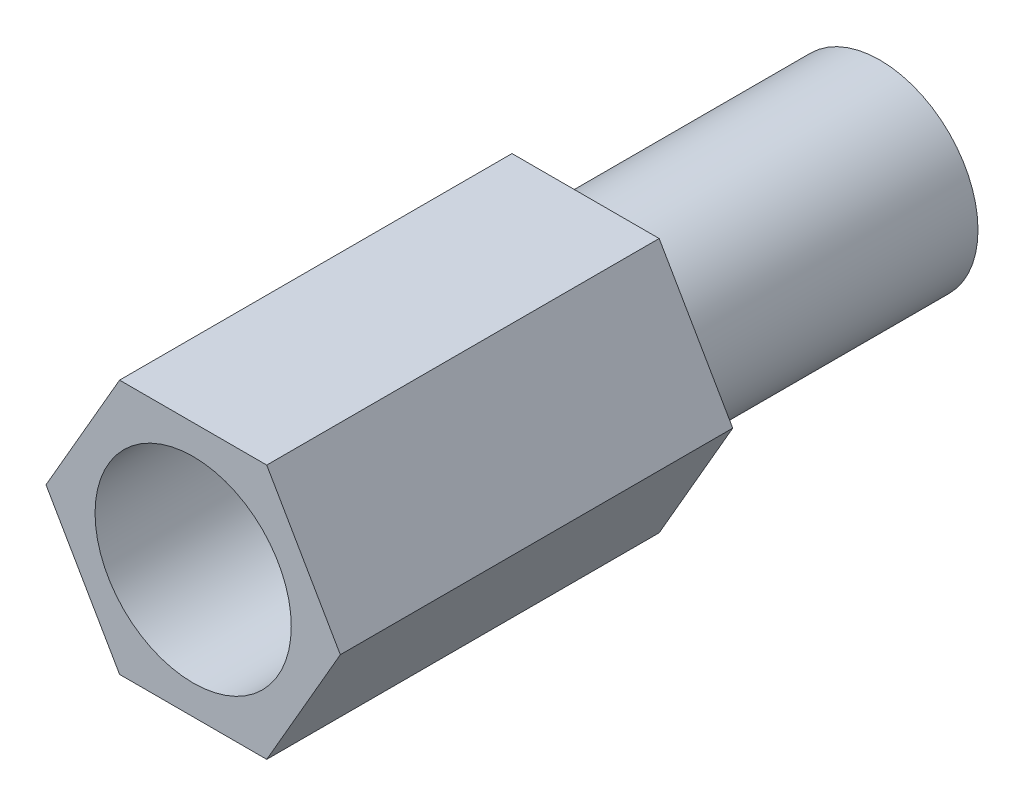
ISO-10303-21;
HEADER;
FILE_DESCRIPTION(('STEP AP214'),'2;1');
FILE_NAME('part.step','',(''),(''),'','','');
FILE_SCHEMA(('AUTOMOTIVE_DESIGN { 1 0 10303 214 1 1 1 1 }'));
ENDSEC;
DATA;
#1=APPLICATION_CONTEXT('core data for automotive mechanical design processes');
#2=APPLICATION_PROTOCOL_DEFINITION('international standard','automotive_design',2000,#1);
#3=PRODUCT_CONTEXT('',#1,'mechanical');
#4=PRODUCT('Part','Part','',(#3));
#5=PRODUCT_RELATED_PRODUCT_CATEGORY('part','',(#4));
#6=PRODUCT_DEFINITION_FORMATION('','',#4);
#7=PRODUCT_DEFINITION_CONTEXT('part definition',#1,'design');
#8=PRODUCT_DEFINITION('design','',#6,#7);
#9=PRODUCT_DEFINITION_SHAPE('','',#8);
#10=(LENGTH_UNIT() NAMED_UNIT(*) SI_UNIT(.MILLI.,.METRE.));
#11=(NAMED_UNIT(*) PLANE_ANGLE_UNIT() SI_UNIT($,.RADIAN.));
#12=(NAMED_UNIT(*) SI_UNIT($,.STERADIAN.) SOLID_ANGLE_UNIT());
#13=UNCERTAINTY_MEASURE_WITH_UNIT(LENGTH_MEASURE(1.E-05),#10,'distance_accuracy_value','');
#14=(GEOMETRIC_REPRESENTATION_CONTEXT(3) GLOBAL_UNCERTAINTY_ASSIGNED_CONTEXT((#13)) GLOBAL_UNIT_ASSIGNED_CONTEXT((#10,
#11,#12)) REPRESENTATION_CONTEXT('',''));
#15=CARTESIAN_POINT('',(0.,0.,0.));
#16=DIRECTION('',(0.,0.,1.));
#17=DIRECTION('',(1.,0.,0.));
#18=AXIS2_PLACEMENT_3D('',#15,#16,#17);
#19=CARTESIAN_POINT('',(0.,0.,-3.));
#20=DIRECTION('',(0.,0.,1.));
#21=DIRECTION('',(1.,0.,0.));
#22=AXIS2_PLACEMENT_3D('',#19,#20,#21);
#23=CYLINDRICAL_SURFACE('',#22,1.);
#24=CARTESIAN_POINT('',(0.,0.,-3.));
#25=DIRECTION('',(0.,0.,1.));
#26=DIRECTION('',(1.,0.,0.));
#27=AXIS2_PLACEMENT_3D('',#24,#25,#26);
#28=CIRCLE('',#27,1.);
#29=CARTESIAN_POINT('',(1.,0.,-3.));
#30=VERTEX_POINT('',#29);
#31=EDGE_CURVE('E11',#30,#30,#28,.T.);
#32=ORIENTED_EDGE('',*,*,#31,.T.);
#33=EDGE_LOOP('',(#32));
#34=FACE_BOUND('',#33,.T.);
#35=CARTESIAN_POINT('',(0.,0.,0.));
#36=DIRECTION('',(0.,0.,1.));
#37=DIRECTION('',(1.,0.,0.));
#38=AXIS2_PLACEMENT_3D('',#35,#36,#37);
#39=CIRCLE('',#38,1.);
#40=CARTESIAN_POINT('',(1.,0.,0.));
#41=VERTEX_POINT('',#40);
#42=EDGE_CURVE('E50',#41,#41,#39,.T.);
#43=ORIENTED_EDGE('',*,*,#42,.F.);
#44=EDGE_LOOP('',(#43));
#45=FACE_BOUND('',#44,.T.);
#46=ADVANCED_FACE('F47',(#34,#45),#23,.T.);
#47=CARTESIAN_POINT('',(0.,0.,-3.));
#48=DIRECTION('',(0.,0.,1.));
#49=DIRECTION('',(1.,0.,0.));
#50=AXIS2_PLACEMENT_3D('',#47,#48,#49);
#51=PLANE('',#50);
#52=ORIENTED_EDGE('',*,*,#31,.F.);
#53=EDGE_LOOP('',(#52));
#54=FACE_BOUND('',#53,.T.);
#55=ADVANCED_FACE('F62',(#54),#51,.F.);
#56=CARTESIAN_POINT('',(0.,0.,0.));
#57=DIRECTION('',(0.,0.,1.));
#58=DIRECTION('',(1.,0.,0.));
#59=AXIS2_PLACEMENT_3D('',#56,#57,#58);
#60=PLANE('',#59);
#61=ORIENTED_EDGE('',*,*,#42,.T.);
#62=EDGE_LOOP('',(#61));
#63=FACE_BOUND('',#62,.T.);
#64=ADVANCED_FACE('F59',(#63),#60,.T.);
#65=CLOSED_SHELL('',(#46,#55,#64));
#66=MANIFOLD_SOLID_BREP('B2',#65);
#67=CARTESIAN_POINT('',(0.,0.,4.));
#68=DIRECTION('',(0.,0.,1.));
#69=DIRECTION('',(1.,0.,0.));
#70=AXIS2_PLACEMENT_3D('',#67,#68,#69);
#71=PLANE('',#70);
#72=DIRECTION('',(-0.5,-0.866025403784439,0.));
#73=VECTOR('',#72,1.);
#74=CARTESIAN_POINT('',(-0.75,1.29903810567666,4.));
#75=LINE('',#74,#73);
#76=CARTESIAN_POINT('',(-0.75,1.29903810567666,4.));
#77=VERTEX_POINT('',#76);
#78=CARTESIAN_POINT('',(-1.5,0.,4.));
#79=VERTEX_POINT('',#78);
#80=EDGE_CURVE('E195',#77,#79,#75,.T.);
#81=ORIENTED_EDGE('',*,*,#80,.T.);
#82=DIRECTION('',(0.5,-0.866025403784439,0.));
#83=VECTOR('',#82,1.);
#84=CARTESIAN_POINT('',(-1.5,0.,4.));
#85=LINE('',#84,#83);
#86=CARTESIAN_POINT('',(-0.75,-1.29903810567666,4.));
#87=VERTEX_POINT('',#86);
#88=EDGE_CURVE('E143',#79,#87,#85,.T.);
#89=ORIENTED_EDGE('',*,*,#88,.T.);
#90=DIRECTION('',(1.,0.,0.));
#91=VECTOR('',#90,1.);
#92=CARTESIAN_POINT('',(-0.75,-1.29903810567666,4.));
#93=LINE('',#92,#91);
#94=CARTESIAN_POINT('',(0.75,-1.29903810567666,4.));
#95=VERTEX_POINT('',#94);
#96=EDGE_CURVE('E156',#87,#95,#93,.T.);
#97=ORIENTED_EDGE('',*,*,#96,.T.);
#98=DIRECTION('',(0.5,0.866025403784439,0.));
#99=VECTOR('',#98,1.);
#100=CARTESIAN_POINT('',(0.75,-1.29903810567666,4.));
#101=LINE('',#100,#99);
#102=CARTESIAN_POINT('',(1.5,0.,4.));
#103=VERTEX_POINT('',#102);
#104=EDGE_CURVE('E150',#95,#103,#101,.T.);
#105=ORIENTED_EDGE('',*,*,#104,.T.);
#106=DIRECTION('',(-0.5,0.866025403784439,0.));
#107=VECTOR('',#106,1.);
#108=CARTESIAN_POINT('',(1.5,0.,4.));
#109=LINE('',#108,#107);
#110=CARTESIAN_POINT('',(0.75,1.29903810567666,4.));
#111=VERTEX_POINT('',#110);
#112=EDGE_CURVE('E154',#103,#111,#109,.T.);
#113=ORIENTED_EDGE('',*,*,#112,.T.);
#114=DIRECTION('',(-1.,0.,0.));
#115=VECTOR('',#114,1.);
#116=CARTESIAN_POINT('',(0.75,1.29903810567666,4.));
#117=LINE('',#116,#115);
#118=EDGE_CURVE('E106',#111,#77,#117,.T.);
#119=ORIENTED_EDGE('',*,*,#118,.T.);
#120=EDGE_LOOP('',(#81,#89,#97,#105,#113,#119));
#121=FACE_BOUND('',#120,.T.);
#122=CARTESIAN_POINT('',(0.,0.,4.));
#123=DIRECTION('',(0.,0.,1.));
#124=DIRECTION('',(1.,0.,0.));
#125=AXIS2_PLACEMENT_3D('',#122,#123,#124);
#126=CIRCLE('',#125,1.);
#127=CARTESIAN_POINT('',(1.,0.,4.));
#128=VERTEX_POINT('',#127);
#129=EDGE_CURVE('E183',#128,#128,#126,.T.);
#130=ORIENTED_EDGE('',*,*,#129,.F.);
#131=EDGE_LOOP('',(#130));
#132=FACE_BOUND('',#131,.T.);
#133=ADVANCED_FACE('F88',(#121,#132),#71,.T.);
#134=CARTESIAN_POINT('',(0.,0.,0.));
#135=DIRECTION('',(0.,0.,1.));
#136=DIRECTION('',(1.,0.,0.));
#137=AXIS2_PLACEMENT_3D('',#134,#135,#136);
#138=PLANE('',#137);
#139=DIRECTION('',(-0.5,-0.866025403784439,0.));
#140=VECTOR('',#139,1.);
#141=CARTESIAN_POINT('',(-0.75,1.29903810567666,0.));
#142=LINE('',#141,#140);
#143=CARTESIAN_POINT('',(-0.75,1.29903810567666,0.));
#144=VERTEX_POINT('',#143);
#145=CARTESIAN_POINT('',(-1.5,0.,0.));
#146=VERTEX_POINT('',#145);
#147=EDGE_CURVE('E178',#144,#146,#142,.T.);
#148=ORIENTED_EDGE('',*,*,#147,.F.);
#149=DIRECTION('',(-1.,0.,0.));
#150=VECTOR('',#149,1.);
#151=CARTESIAN_POINT('',(0.75,1.29903810567666,0.));
#152=LINE('',#151,#150);
#153=CARTESIAN_POINT('',(0.75,1.29903810567666,0.));
#154=VERTEX_POINT('',#153);
#155=EDGE_CURVE('E135',#154,#144,#152,.T.);
#156=ORIENTED_EDGE('',*,*,#155,.F.);
#157=DIRECTION('',(-0.5,0.866025403784439,0.));
#158=VECTOR('',#157,1.);
#159=CARTESIAN_POINT('',(1.5,0.,0.));
#160=LINE('',#159,#158);
#161=CARTESIAN_POINT('',(1.5,0.,0.));
#162=VERTEX_POINT('',#161);
#163=EDGE_CURVE('E129',#162,#154,#160,.T.);
#164=ORIENTED_EDGE('',*,*,#163,.F.);
#165=DIRECTION('',(0.5,0.866025403784439,0.));
#166=VECTOR('',#165,1.);
#167=CARTESIAN_POINT('',(0.75,-1.29903810567666,0.));
#168=LINE('',#167,#166);
#169=CARTESIAN_POINT('',(0.75,-1.29903810567666,0.));
#170=VERTEX_POINT('',#169);
#171=EDGE_CURVE('E165',#170,#162,#168,.T.);
#172=ORIENTED_EDGE('',*,*,#171,.F.);
#173=DIRECTION('',(1.,0.,0.));
#174=VECTOR('',#173,1.);
#175=CARTESIAN_POINT('',(-0.75,-1.29903810567666,0.));
#176=LINE('',#175,#174);
#177=CARTESIAN_POINT('',(-0.75,-1.29903810567666,0.));
#178=VERTEX_POINT('',#177);
#179=EDGE_CURVE('E186',#178,#170,#176,.T.);
#180=ORIENTED_EDGE('',*,*,#179,.F.);
#181=DIRECTION('',(0.5,-0.866025403784439,0.));
#182=VECTOR('',#181,1.);
#183=CARTESIAN_POINT('',(-1.5,0.,0.));
#184=LINE('',#183,#182);
#185=EDGE_CURVE('E182',#146,#178,#184,.T.);
#186=ORIENTED_EDGE('',*,*,#185,.F.);
#187=EDGE_LOOP('',(#148,#156,#164,#172,#180,#186));
#188=FACE_BOUND('',#187,.T.);
#189=CARTESIAN_POINT('',(0.,0.,0.));
#190=DIRECTION('',(0.,0.,1.));
#191=DIRECTION('',(1.,0.,0.));
#192=AXIS2_PLACEMENT_3D('',#189,#190,#191);
#193=CIRCLE('',#192,1.);
#194=CARTESIAN_POINT('',(1.,0.,0.));
#195=VERTEX_POINT('',#194);
#196=EDGE_CURVE('E292',#195,#195,#193,.T.);
#197=ORIENTED_EDGE('',*,*,#196,.T.);
#198=EDGE_LOOP('',(#197));
#199=FACE_BOUND('',#198,.T.);
#200=ADVANCED_FACE('F208',(#188,#199),#138,.F.);
#201=CARTESIAN_POINT('',(-0.75,1.29903810567666,4.));
#202=DIRECTION('',(0.866025403784439,-0.5,0.));
#203=DIRECTION('',(0.5,0.866025403784439,0.));
#204=AXIS2_PLACEMENT_3D('',#201,#202,#203);
#205=PLANE('',#204);
#206=ORIENTED_EDGE('',*,*,#147,.T.);
#207=DIRECTION('',(0.,0.,-1.));
#208=VECTOR('',#207,1.);
#209=CARTESIAN_POINT('',(-1.5,0.,4.));
#210=LINE('',#209,#208);
#211=EDGE_CURVE('E45',#79,#146,#210,.T.);
#212=ORIENTED_EDGE('',*,*,#211,.F.);
#213=ORIENTED_EDGE('',*,*,#80,.F.);
#214=DIRECTION('',(0.,0.,-1.));
#215=VECTOR('',#214,1.);
#216=CARTESIAN_POINT('',(-0.75,1.29903810567666,4.));
#217=LINE('',#216,#215);
#218=EDGE_CURVE('E174',#77,#144,#217,.T.);
#219=ORIENTED_EDGE('',*,*,#218,.T.);
#220=EDGE_LOOP('',(#206,#212,#213,#219));
#221=FACE_BOUND('',#220,.T.);
#222=ADVANCED_FACE('F90',(#221),#205,.F.);
#223=CARTESIAN_POINT('',(-1.5,0.,4.));
#224=DIRECTION('',(0.866025403784439,0.5,0.));
#225=DIRECTION('',(-0.5,0.866025403784439,0.));
#226=AXIS2_PLACEMENT_3D('',#223,#224,#225);
#227=PLANE('',#226);
#228=ORIENTED_EDGE('',*,*,#185,.T.);
#229=DIRECTION('',(0.,0.,-1.));
#230=VECTOR('',#229,1.);
#231=CARTESIAN_POINT('',(-0.75,-1.29903810567666,4.));
#232=LINE('',#231,#230);
#233=EDGE_CURVE('E98',#87,#178,#232,.T.);
#234=ORIENTED_EDGE('',*,*,#233,.F.);
#235=ORIENTED_EDGE('',*,*,#88,.F.);
#236=ORIENTED_EDGE('',*,*,#211,.T.);
#237=EDGE_LOOP('',(#228,#234,#235,#236));
#238=FACE_BOUND('',#237,.T.);
#239=ADVANCED_FACE('F233',(#238),#227,.F.);
#240=CARTESIAN_POINT('',(-0.75,-1.29903810567666,4.));
#241=DIRECTION('',(0.,1.,0.));
#242=DIRECTION('',(-1.,0.,0.));
#243=AXIS2_PLACEMENT_3D('',#240,#241,#242);
#244=PLANE('',#243);
#245=ORIENTED_EDGE('',*,*,#179,.T.);
#246=DIRECTION('',(0.,0.,-1.));
#247=VECTOR('',#246,1.);
#248=CARTESIAN_POINT('',(0.75,-1.29903810567666,4.));
#249=LINE('',#248,#247);
#250=EDGE_CURVE('E167',#95,#170,#249,.T.);
#251=ORIENTED_EDGE('',*,*,#250,.F.);
#252=ORIENTED_EDGE('',*,*,#96,.F.);
#253=ORIENTED_EDGE('',*,*,#233,.T.);
#254=EDGE_LOOP('',(#245,#251,#252,#253));
#255=FACE_BOUND('',#254,.T.);
#256=ADVANCED_FACE('F205',(#255),#244,.F.);
#257=CARTESIAN_POINT('',(0.75,-1.29903810567666,4.));
#258=DIRECTION('',(-0.866025403784439,0.499999999999999,0.));
#259=DIRECTION('',(-0.499999999999999,-0.866025403784439,0.));
#260=AXIS2_PLACEMENT_3D('',#257,#258,#259);
#261=PLANE('',#260);
#262=ORIENTED_EDGE('',*,*,#171,.T.);
#263=DIRECTION('',(0.,0.,-1.));
#264=VECTOR('',#263,1.);
#265=CARTESIAN_POINT('',(1.5,0.,4.));
#266=LINE('',#265,#264);
#267=EDGE_CURVE('E162',#103,#162,#266,.T.);
#268=ORIENTED_EDGE('',*,*,#267,.F.);
#269=ORIENTED_EDGE('',*,*,#104,.F.);
#270=ORIENTED_EDGE('',*,*,#250,.T.);
#271=EDGE_LOOP('',(#262,#268,#269,#270));
#272=FACE_BOUND('',#271,.T.);
#273=ADVANCED_FACE('F163',(#272),#261,.F.);
#274=CARTESIAN_POINT('',(1.5,0.,4.));
#275=DIRECTION('',(-0.866025403784439,-0.5,0.));
#276=DIRECTION('',(0.5,-0.866025403784439,0.));
#277=AXIS2_PLACEMENT_3D('',#274,#275,#276);
#278=PLANE('',#277);
#279=ORIENTED_EDGE('',*,*,#163,.T.);
#280=DIRECTION('',(0.,0.,-1.));
#281=VECTOR('',#280,1.);
#282=CARTESIAN_POINT('',(0.75,1.29903810567666,4.));
#283=LINE('',#282,#281);
#284=EDGE_CURVE('E168',#111,#154,#283,.T.);
#285=ORIENTED_EDGE('',*,*,#284,.F.);
#286=ORIENTED_EDGE('',*,*,#112,.F.);
#287=ORIENTED_EDGE('',*,*,#267,.T.);
#288=EDGE_LOOP('',(#279,#285,#286,#287));
#289=FACE_BOUND('',#288,.T.);
#290=ADVANCED_FACE('F170',(#289),#278,.F.);
#291=CARTESIAN_POINT('',(0.75,1.29903810567666,4.));
#292=DIRECTION('',(0.,-1.,0.));
#293=DIRECTION('',(0.,0.,-1.));
#294=AXIS2_PLACEMENT_3D('',#291,#292,#293);
#295=PLANE('',#294);
#296=ORIENTED_EDGE('',*,*,#155,.T.);
#297=ORIENTED_EDGE('',*,*,#218,.F.);
#298=ORIENTED_EDGE('',*,*,#118,.F.);
#299=ORIENTED_EDGE('',*,*,#284,.T.);
#300=EDGE_LOOP('',(#296,#297,#298,#299));
#301=FACE_BOUND('',#300,.T.);
#302=ADVANCED_FACE('F213',(#301),#295,.F.);
#303=CARTESIAN_POINT('',(0.,0.,4.));
#304=DIRECTION('',(0.,0.,-1.));
#305=DIRECTION('',(-1.,0.,0.));
#306=AXIS2_PLACEMENT_3D('',#303,#304,#305);
#307=CYLINDRICAL_SURFACE('',#306,1.);
#308=ORIENTED_EDGE('',*,*,#129,.T.);
#309=EDGE_LOOP('',(#308));
#310=FACE_BOUND('',#309,.T.);
#311=ORIENTED_EDGE('',*,*,#196,.F.);
#312=EDGE_LOOP('',(#311));
#313=FACE_BOUND('',#312,.T.);
#314=ADVANCED_FACE('F215',(#310,#313),#307,.F.);
#315=CLOSED_SHELL('',(#133,#200,#222,#239,#256,#273,#290,#302,#314));
#316=MANIFOLD_SOLID_BREP('B6',#315);
#317=ADVANCED_BREP_SHAPE_REPRESENTATION('',(#18,#66,#316),#14);
#318=SHAPE_DEFINITION_REPRESENTATION(#9,#317);
ENDSEC;
END-ISO-10303-21;
